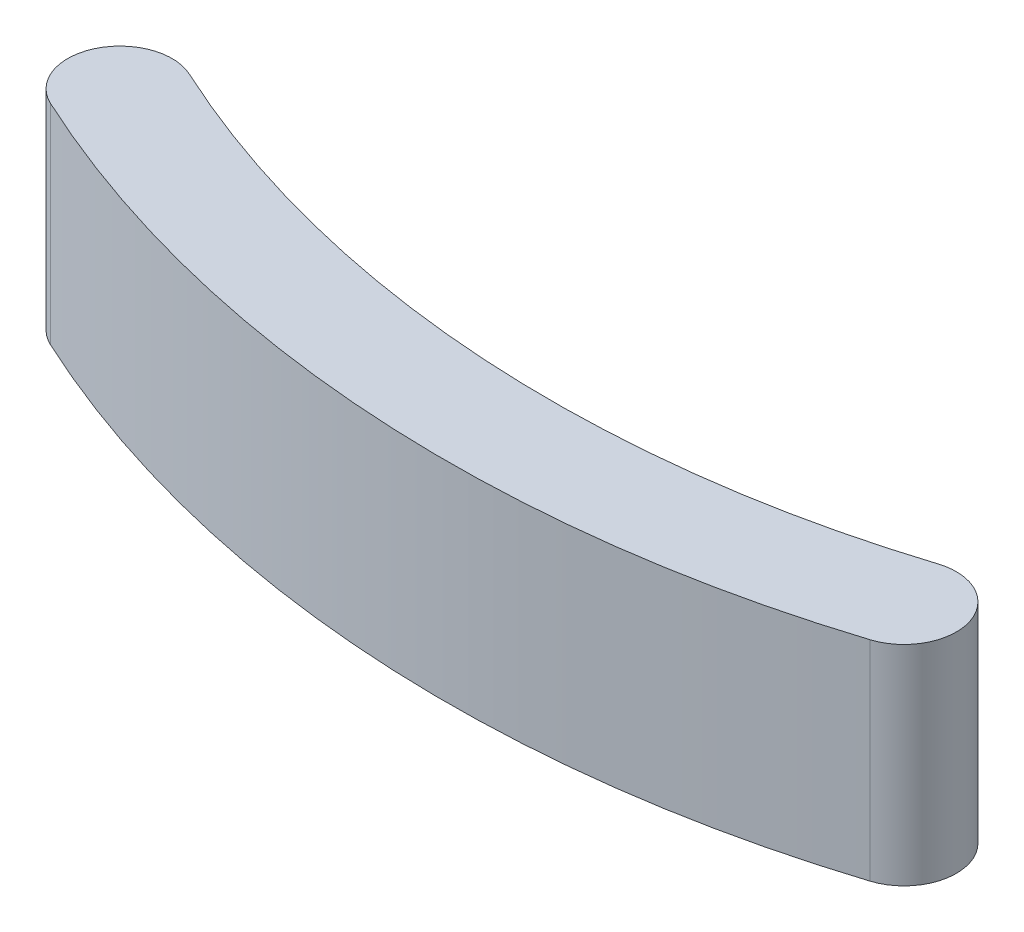
ISO-10303-21;
HEADER;
FILE_DESCRIPTION(('STEP AP214'),'2;1');
FILE_NAME('part.step','',(''),(''),'','','');
FILE_SCHEMA(('AUTOMOTIVE_DESIGN { 1 0 10303 214 1 1 1 1 }'));
ENDSEC;
DATA;
#1=APPLICATION_CONTEXT('core data for automotive mechanical design processes');
#2=APPLICATION_PROTOCOL_DEFINITION('international standard','automotive_design',2000,#1);
#3=PRODUCT_CONTEXT('',#1,'mechanical');
#4=PRODUCT('Part','Part','',(#3));
#5=PRODUCT_RELATED_PRODUCT_CATEGORY('part','',(#4));
#6=PRODUCT_DEFINITION_FORMATION('','',#4);
#7=PRODUCT_DEFINITION_CONTEXT('part definition',#1,'design');
#8=PRODUCT_DEFINITION('design','',#6,#7);
#9=PRODUCT_DEFINITION_SHAPE('','',#8);
#10=(LENGTH_UNIT() NAMED_UNIT(*) SI_UNIT(.MILLI.,.METRE.));
#11=(NAMED_UNIT(*) PLANE_ANGLE_UNIT() SI_UNIT($,.RADIAN.));
#12=(NAMED_UNIT(*) SI_UNIT($,.STERADIAN.) SOLID_ANGLE_UNIT());
#13=UNCERTAINTY_MEASURE_WITH_UNIT(LENGTH_MEASURE(1.E-05),#10,'distance_accuracy_value','');
#14=(GEOMETRIC_REPRESENTATION_CONTEXT(3) GLOBAL_UNCERTAINTY_ASSIGNED_CONTEXT((#13)) GLOBAL_UNIT_ASSIGNED_CONTEXT((#10,
#11,#12)) REPRESENTATION_CONTEXT('',''));
#15=CARTESIAN_POINT('',(0.,0.,0.));
#16=DIRECTION('',(0.,0.,1.));
#17=DIRECTION('',(1.,0.,0.));
#18=AXIS2_PLACEMENT_3D('',#15,#16,#17);
#19=CARTESIAN_POINT('',(0.,20.,0.));
#20=DIRECTION('',(0.,-1.,0.));
#21=DIRECTION('',(0.,0.,-1.));
#22=AXIS2_PLACEMENT_3D('',#19,#20,#21);
#23=CYLINDRICAL_SURFACE('',#22,5.00000000000001);
#24=CARTESIAN_POINT('',(0.,0.,0.));
#25=DIRECTION('',(0.,1.,0.));
#26=DIRECTION('',(0.,0.,1.));
#27=AXIS2_PLACEMENT_3D('',#24,#25,#26);
#28=CIRCLE('',#27,5.00000000000001);
#29=CARTESIAN_POINT('',(2.09849970216388,0.,-4.53831455498825));
#30=VERTEX_POINT('',#29);
#31=CARTESIAN_POINT('',(-2.09849970216394,0.,4.53831455498822));
#32=VERTEX_POINT('',#31);
#33=EDGE_CURVE('E97',#30,#32,#28,.T.);
#34=ORIENTED_EDGE('',*,*,#33,.T.);
#35=DIRECTION('',(0.,-1.,0.));
#36=VECTOR('',#35,1.);
#37=CARTESIAN_POINT('',(-2.09849970216394,20.,4.53831455498822));
#38=LINE('',#37,#36);
#39=CARTESIAN_POINT('',(-2.09849970216394,20.,4.53831455498822));
#40=VERTEX_POINT('',#39);
#41=EDGE_CURVE('E11',#40,#32,#38,.T.);
#42=ORIENTED_EDGE('',*,*,#41,.F.);
#43=CARTESIAN_POINT('',(0.,20.,0.));
#44=DIRECTION('',(0.,1.,0.));
#45=DIRECTION('',(0.,0.,1.));
#46=AXIS2_PLACEMENT_3D('',#43,#44,#45);
#47=CIRCLE('',#46,5.00000000000001);
#48=CARTESIAN_POINT('',(2.09849970216388,20.,-4.53831455498825));
#49=VERTEX_POINT('',#48);
#50=EDGE_CURVE('E85',#49,#40,#47,.T.);
#51=ORIENTED_EDGE('',*,*,#50,.F.);
#52=DIRECTION('',(0.,-1.,0.));
#53=VECTOR('',#52,1.);
#54=CARTESIAN_POINT('',(2.09849970216388,20.,-4.53831455498825));
#55=LINE('',#54,#53);
#56=EDGE_CURVE('E93',#49,#30,#55,.T.);
#57=ORIENTED_EDGE('',*,*,#56,.T.);
#58=EDGE_LOOP('',(#34,#42,#51,#57));
#59=FACE_BOUND('',#58,.T.);
#60=ADVANCED_FACE('F34',(#59),#23,.T.);
#61=CARTESIAN_POINT('',(46.4322916666667,20.,-100.416666666667));
#62=DIRECTION('',(0.,-1.,0.));
#63=DIRECTION('',(0.,0.,-1.));
#64=AXIS2_PLACEMENT_3D('',#61,#62,#63);
#65=CYLINDRICAL_SURFACE('',#64,115.632114026004);
#66=CARTESIAN_POINT('',(46.4322916666667,0.,-100.416666666667));
#67=DIRECTION('',(0.,1.,0.));
#68=DIRECTION('',(0.,0.,1.));
#69=AXIS2_PLACEMENT_3D('',#66,#67,#68);
#70=CIRCLE('',#69,115.632114026004);
#71=CARTESIAN_POINT('',(81.5170869972458,0.,9.76428872370136));
#72=VERTEX_POINT('',#71);
#73=EDGE_CURVE('E89',#32,#72,#70,.T.);
#74=ORIENTED_EDGE('',*,*,#73,.T.);
#75=DIRECTION('',(0.,-1.,0.));
#76=VECTOR('',#75,1.);
#77=CARTESIAN_POINT('',(81.5170869972458,20.,9.76428872370136));
#78=LINE('',#77,#76);
#79=CARTESIAN_POINT('',(81.5170869972458,20.,9.76428872370136));
#80=VERTEX_POINT('',#79);
#81=EDGE_CURVE('E42',#80,#72,#78,.T.);
#82=ORIENTED_EDGE('',*,*,#81,.F.);
#83=CARTESIAN_POINT('',(46.4322916666667,20.,-100.416666666667));
#84=DIRECTION('',(0.,1.,0.));
#85=DIRECTION('',(0.,0.,1.));
#86=AXIS2_PLACEMENT_3D('',#83,#84,#85);
#87=CIRCLE('',#86,115.632114026004);
#88=EDGE_CURVE('E80',#40,#80,#87,.T.);
#89=ORIENTED_EDGE('',*,*,#88,.F.);
#90=ORIENTED_EDGE('',*,*,#41,.T.);
#91=EDGE_LOOP('',(#74,#82,#89,#90));
#92=FACE_BOUND('',#91,.T.);
#93=ADVANCED_FACE('F88',(#92),#65,.T.);
#94=CARTESIAN_POINT('',(80.,20.,5.));
#95=DIRECTION('',(0.,-1.,0.));
#96=DIRECTION('',(0.,0.,-1.));
#97=AXIS2_PLACEMENT_3D('',#94,#95,#96);
#98=CYLINDRICAL_SURFACE('',#97,5.);
#99=CARTESIAN_POINT('',(80.,0.,5.));
#100=DIRECTION('',(0.,1.,0.));
#101=DIRECTION('',(0.,0.,1.));
#102=AXIS2_PLACEMENT_3D('',#99,#100,#101);
#103=CIRCLE('',#102,5.);
#104=CARTESIAN_POINT('',(78.4829130027542,0.,0.23571127629866));
#105=VERTEX_POINT('',#104);
#106=EDGE_CURVE('E67',#72,#105,#103,.T.);
#107=ORIENTED_EDGE('',*,*,#106,.T.);
#108=DIRECTION('',(0.,-1.,0.));
#109=VECTOR('',#108,1.);
#110=CARTESIAN_POINT('',(78.4829130027542,20.,0.23571127629866));
#111=LINE('',#110,#109);
#112=CARTESIAN_POINT('',(78.4829130027542,20.,0.23571127629866));
#113=VERTEX_POINT('',#112);
#114=EDGE_CURVE('E90',#113,#105,#111,.T.);
#115=ORIENTED_EDGE('',*,*,#114,.F.);
#116=CARTESIAN_POINT('',(80.,20.,5.));
#117=DIRECTION('',(0.,1.,0.));
#118=DIRECTION('',(0.,0.,1.));
#119=AXIS2_PLACEMENT_3D('',#116,#117,#118);
#120=CIRCLE('',#119,5.);
#121=EDGE_CURVE('E83',#80,#113,#120,.T.);
#122=ORIENTED_EDGE('',*,*,#121,.F.);
#123=ORIENTED_EDGE('',*,*,#81,.T.);
#124=EDGE_LOOP('',(#107,#115,#122,#123));
#125=FACE_BOUND('',#124,.T.);
#126=ADVANCED_FACE('F91',(#125),#98,.T.);
#127=CARTESIAN_POINT('',(46.4322916666667,20.,-100.416666666667));
#128=DIRECTION('',(0.,-1.,0.));
#129=DIRECTION('',(0.,0.,-1.));
#130=AXIS2_PLACEMENT_3D('',#127,#128,#129);
#131=CYLINDRICAL_SURFACE('',#130,105.632114026004);
#132=CARTESIAN_POINT('',(46.4322916666667,0.,-100.416666666667));
#133=DIRECTION('',(0.,-1.,0.));
#134=DIRECTION('',(0.,0.,1.));
#135=AXIS2_PLACEMENT_3D('',#132,#133,#134);
#136=CIRCLE('',#135,105.632114026004);
#137=EDGE_CURVE('E73',#105,#30,#136,.T.);
#138=ORIENTED_EDGE('',*,*,#137,.T.);
#139=ORIENTED_EDGE('',*,*,#56,.F.);
#140=CARTESIAN_POINT('',(46.4322916666667,20.,-100.416666666667));
#141=DIRECTION('',(0.,-1.,0.));
#142=DIRECTION('',(0.,0.,1.));
#143=AXIS2_PLACEMENT_3D('',#140,#141,#142);
#144=CIRCLE('',#143,105.632114026004);
#145=EDGE_CURVE('E50',#113,#49,#144,.T.);
#146=ORIENTED_EDGE('',*,*,#145,.F.);
#147=ORIENTED_EDGE('',*,*,#114,.T.);
#148=EDGE_LOOP('',(#138,#139,#146,#147));
#149=FACE_BOUND('',#148,.T.);
#150=ADVANCED_FACE('F104',(#149),#131,.F.);
#151=CARTESIAN_POINT('',(23.2161458333333,20.,-50.2083333333333));
#152=DIRECTION('',(0.,1.,0.));
#153=DIRECTION('',(0.,0.,1.));
#154=AXIS2_PLACEMENT_3D('',#151,#152,#153);
#155=PLANE('',#154);
#156=ORIENTED_EDGE('',*,*,#50,.T.);
#157=ORIENTED_EDGE('',*,*,#88,.T.);
#158=ORIENTED_EDGE('',*,*,#121,.T.);
#159=ORIENTED_EDGE('',*,*,#145,.T.);
#160=EDGE_LOOP('',(#156,#157,#158,#159));
#161=FACE_BOUND('',#160,.T.);
#162=ADVANCED_FACE('F81',(#161),#155,.T.);
#163=CARTESIAN_POINT('',(23.2161458333333,0.,-50.2083333333333));
#164=DIRECTION('',(0.,1.,0.));
#165=DIRECTION('',(0.,0.,1.));
#166=AXIS2_PLACEMENT_3D('',#163,#164,#165);
#167=PLANE('',#166);
#168=ORIENTED_EDGE('',*,*,#33,.F.);
#169=ORIENTED_EDGE('',*,*,#137,.F.);
#170=ORIENTED_EDGE('',*,*,#106,.F.);
#171=ORIENTED_EDGE('',*,*,#73,.F.);
#172=EDGE_LOOP('',(#168,#169,#170,#171));
#173=FACE_BOUND('',#172,.T.);
#174=ADVANCED_FACE('F107',(#173),#167,.F.);
#175=CLOSED_SHELL('',(#60,#93,#126,#150,#162,#174));
#176=MANIFOLD_SOLID_BREP('B2',#175);
#177=ADVANCED_BREP_SHAPE_REPRESENTATION('',(#18,#176),#14);
#178=SHAPE_DEFINITION_REPRESENTATION(#9,#177);
ENDSEC;
END-ISO-10303-21;
